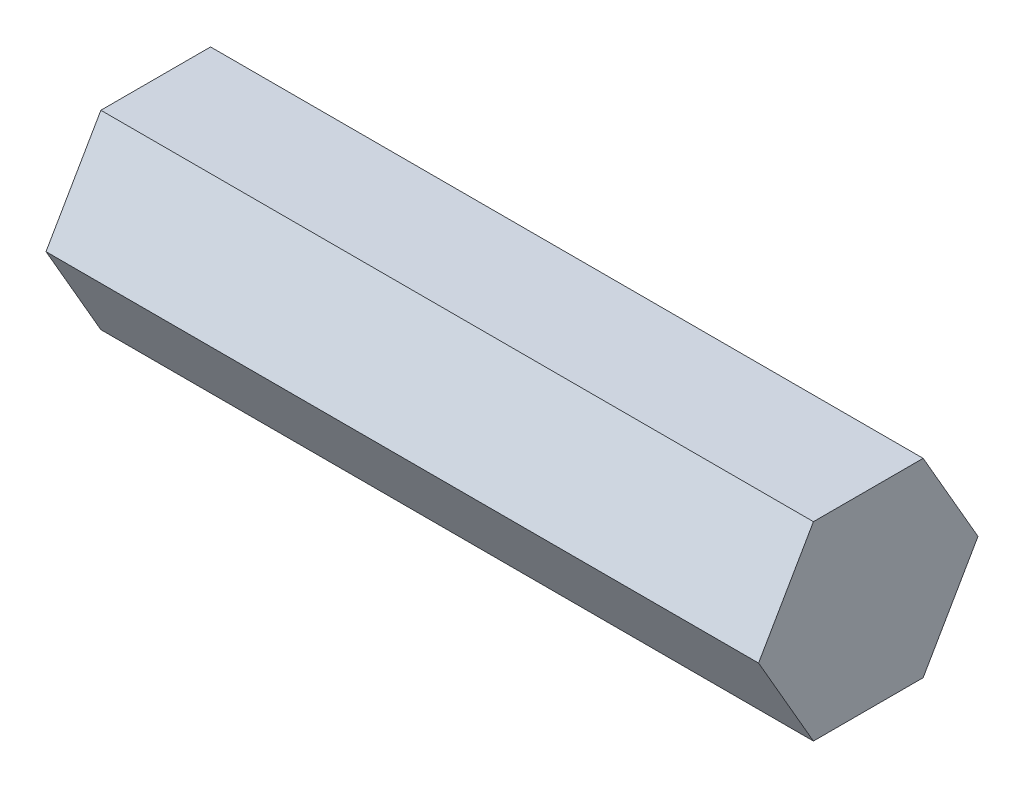
ISO-10303-21;
HEADER;
FILE_DESCRIPTION(('STEP AP214'),'2;1');
FILE_NAME('part.step','',(''),(''),'','','');
FILE_SCHEMA(('AUTOMOTIVE_DESIGN { 1 0 10303 214 1 1 1 1 }'));
ENDSEC;
DATA;
#1=APPLICATION_CONTEXT('core data for automotive mechanical design processes');
#2=APPLICATION_PROTOCOL_DEFINITION('international standard','automotive_design',2000,#1);
#3=PRODUCT_CONTEXT('',#1,'mechanical');
#4=PRODUCT('Part','Part','',(#3));
#5=PRODUCT_RELATED_PRODUCT_CATEGORY('part','',(#4));
#6=PRODUCT_DEFINITION_FORMATION('','',#4);
#7=PRODUCT_DEFINITION_CONTEXT('part definition',#1,'design');
#8=PRODUCT_DEFINITION('design','',#6,#7);
#9=PRODUCT_DEFINITION_SHAPE('','',#8);
#10=(LENGTH_UNIT() NAMED_UNIT(*) SI_UNIT(.MILLI.,.METRE.));
#11=(NAMED_UNIT(*) PLANE_ANGLE_UNIT() SI_UNIT($,.RADIAN.));
#12=(NAMED_UNIT(*) SI_UNIT($,.STERADIAN.) SOLID_ANGLE_UNIT());
#13=UNCERTAINTY_MEASURE_WITH_UNIT(LENGTH_MEASURE(1.E-05),#10,'distance_accuracy_value','');
#14=(GEOMETRIC_REPRESENTATION_CONTEXT(3) GLOBAL_UNCERTAINTY_ASSIGNED_CONTEXT((#13)) GLOBAL_UNIT_ASSIGNED_CONTEXT((#10,
#11,#12)) REPRESENTATION_CONTEXT('',''));
#15=CARTESIAN_POINT('',(0.,0.,0.));
#16=DIRECTION('',(0.,0.,1.));
#17=DIRECTION('',(1.,0.,0.));
#18=AXIS2_PLACEMENT_3D('',#15,#16,#17);
#19=CARTESIAN_POINT('',(0.,0.,0.));
#20=DIRECTION('',(1.,0.,0.));
#21=DIRECTION('',(0.,0.,-1.));
#22=AXIS2_PLACEMENT_3D('',#19,#20,#21);
#23=PLANE('',#22);
#24=DIRECTION('',(0.,-0.866025403784439,0.5));
#25=VECTOR('',#24,1.);
#26=CARTESIAN_POINT('',(0.,2.,1.15470053837925));
#27=LINE('',#26,#25);
#28=CARTESIAN_POINT('',(0.,2.,1.15470053837925));
#29=VERTEX_POINT('',#28);
#30=CARTESIAN_POINT('',(0.,0.,2.3094010767585));
#31=VERTEX_POINT('',#30);
#32=EDGE_CURVE('E100',#29,#31,#27,.T.);
#33=ORIENTED_EDGE('',*,*,#32,.F.);
#34=DIRECTION('',(0.,0.,1.));
#35=VECTOR('',#34,1.);
#36=CARTESIAN_POINT('',(0.,2.,-1.15470053837925));
#37=LINE('',#36,#35);
#38=CARTESIAN_POINT('',(0.,2.,-1.15470053837925));
#39=VERTEX_POINT('',#38);
#40=EDGE_CURVE('E111',#39,#29,#37,.T.);
#41=ORIENTED_EDGE('',*,*,#40,.F.);
#42=DIRECTION('',(0.,0.866025403784438,0.5));
#43=VECTOR('',#42,1.);
#44=CARTESIAN_POINT('',(0.,0.,-2.3094010767585));
#45=LINE('',#44,#43);
#46=CARTESIAN_POINT('',(0.,0.,-2.3094010767585));
#47=VERTEX_POINT('',#46);
#48=EDGE_CURVE('E141',#47,#39,#45,.T.);
#49=ORIENTED_EDGE('',*,*,#48,.F.);
#50=DIRECTION('',(0.,0.866025403784439,-0.5));
#51=VECTOR('',#50,1.);
#52=CARTESIAN_POINT('',(0.,-2.,-1.15470053837925));
#53=LINE('',#52,#51);
#54=CARTESIAN_POINT('',(0.,-2.,-1.15470053837925));
#55=VERTEX_POINT('',#54);
#56=EDGE_CURVE('E88',#55,#47,#53,.T.);
#57=ORIENTED_EDGE('',*,*,#56,.F.);
#58=DIRECTION('',(0.,0.,-1.));
#59=VECTOR('',#58,1.);
#60=CARTESIAN_POINT('',(0.,-2.,1.15470053837925));
#61=LINE('',#60,#59);
#62=CARTESIAN_POINT('',(0.,-2.,1.15470053837925));
#63=VERTEX_POINT('',#62);
#64=EDGE_CURVE('E54',#63,#55,#61,.T.);
#65=ORIENTED_EDGE('',*,*,#64,.F.);
#66=DIRECTION('',(0.,-0.866025403784439,-0.5));
#67=VECTOR('',#66,1.);
#68=CARTESIAN_POINT('',(0.,0.,2.3094010767585));
#69=LINE('',#68,#67);
#70=EDGE_CURVE('E110',#31,#63,#69,.T.);
#71=ORIENTED_EDGE('',*,*,#70,.F.);
#72=EDGE_LOOP('',(#33,#41,#49,#57,#65,#71));
#73=FACE_BOUND('',#72,.T.);
#74=ADVANCED_FACE('F37',(#73),#23,.F.);
#75=CARTESIAN_POINT('',(0.,-2.,-1.15470053837925));
#76=DIRECTION('',(0.,-0.5,-0.866025403784439));
#77=DIRECTION('',(0.,0.866025403784439,-0.5));
#78=AXIS2_PLACEMENT_3D('',#75,#76,#77);
#79=PLANE('',#78);
#80=ORIENTED_EDGE('',*,*,#56,.T.);
#81=DIRECTION('',(1.,0.,0.));
#82=VECTOR('',#81,1.);
#83=CARTESIAN_POINT('',(0.,0.,-2.3094010767585));
#84=LINE('',#83,#82);
#85=CARTESIAN_POINT('',(15.,0.,-2.3094010767585));
#86=VERTEX_POINT('',#85);
#87=EDGE_CURVE('E40',#47,#86,#84,.T.);
#88=ORIENTED_EDGE('',*,*,#87,.T.);
#89=DIRECTION('',(0.,0.866025403784439,-0.5));
#90=VECTOR('',#89,1.);
#91=CARTESIAN_POINT('',(15.,-2.,-1.15470053837925));
#92=LINE('',#91,#90);
#93=CARTESIAN_POINT('',(15.,-2.,-1.15470053837925));
#94=VERTEX_POINT('',#93);
#95=EDGE_CURVE('E120',#94,#86,#92,.T.);
#96=ORIENTED_EDGE('',*,*,#95,.F.);
#97=DIRECTION('',(1.,0.,0.));
#98=VECTOR('',#97,1.);
#99=CARTESIAN_POINT('',(0.,-2.,-1.15470053837925));
#100=LINE('',#99,#98);
#101=EDGE_CURVE('E11',#55,#94,#100,.T.);
#102=ORIENTED_EDGE('',*,*,#101,.F.);
#103=EDGE_LOOP('',(#80,#88,#96,#102));
#104=FACE_BOUND('',#103,.T.);
#105=ADVANCED_FACE('F138',(#104),#79,.T.);
#106=CARTESIAN_POINT('',(0.,-2.,1.15470053837925));
#107=DIRECTION('',(0.,-1.,0.));
#108=DIRECTION('',(0.,0.,-1.));
#109=AXIS2_PLACEMENT_3D('',#106,#107,#108);
#110=PLANE('',#109);
#111=ORIENTED_EDGE('',*,*,#64,.T.);
#112=ORIENTED_EDGE('',*,*,#101,.T.);
#113=DIRECTION('',(0.,0.,-1.));
#114=VECTOR('',#113,1.);
#115=CARTESIAN_POINT('',(15.,-2.,1.15470053837925));
#116=LINE('',#115,#114);
#117=CARTESIAN_POINT('',(15.,-2.,1.15470053837925));
#118=VERTEX_POINT('',#117);
#119=EDGE_CURVE('E81',#118,#94,#116,.T.);
#120=ORIENTED_EDGE('',*,*,#119,.F.);
#121=DIRECTION('',(1.,0.,0.));
#122=VECTOR('',#121,1.);
#123=CARTESIAN_POINT('',(0.,-2.,1.15470053837925));
#124=LINE('',#123,#122);
#125=EDGE_CURVE('E46',#63,#118,#124,.T.);
#126=ORIENTED_EDGE('',*,*,#125,.F.);
#127=EDGE_LOOP('',(#111,#112,#120,#126));
#128=FACE_BOUND('',#127,.T.);
#129=ADVANCED_FACE('F157',(#128),#110,.T.);
#130=CARTESIAN_POINT('',(0.,0.,2.3094010767585));
#131=DIRECTION('',(0.,-0.5,0.866025403784439));
#132=DIRECTION('',(0.,-0.866025403784439,-0.5));
#133=AXIS2_PLACEMENT_3D('',#130,#131,#132);
#134=PLANE('',#133);
#135=ORIENTED_EDGE('',*,*,#70,.T.);
#136=ORIENTED_EDGE('',*,*,#125,.T.);
#137=DIRECTION('',(0.,-0.866025403784439,-0.5));
#138=VECTOR('',#137,1.);
#139=CARTESIAN_POINT('',(15.,0.,2.3094010767585));
#140=LINE('',#139,#138);
#141=CARTESIAN_POINT('',(15.,0.,2.3094010767585));
#142=VERTEX_POINT('',#141);
#143=EDGE_CURVE('E77',#142,#118,#140,.T.);
#144=ORIENTED_EDGE('',*,*,#143,.F.);
#145=DIRECTION('',(1.,0.,0.));
#146=VECTOR('',#145,1.);
#147=CARTESIAN_POINT('',(0.,0.,2.3094010767585));
#148=LINE('',#147,#146);
#149=EDGE_CURVE('E104',#31,#142,#148,.T.);
#150=ORIENTED_EDGE('',*,*,#149,.F.);
#151=EDGE_LOOP('',(#135,#136,#144,#150));
#152=FACE_BOUND('',#151,.T.);
#153=ADVANCED_FACE('F114',(#152),#134,.T.);
#154=CARTESIAN_POINT('',(0.,2.,1.15470053837925));
#155=DIRECTION('',(0.,0.5,0.866025403784439));
#156=DIRECTION('',(0.,-0.866025403784439,0.5));
#157=AXIS2_PLACEMENT_3D('',#154,#155,#156);
#158=PLANE('',#157);
#159=ORIENTED_EDGE('',*,*,#32,.T.);
#160=ORIENTED_EDGE('',*,*,#149,.T.);
#161=DIRECTION('',(0.,-0.866025403784439,0.5));
#162=VECTOR('',#161,1.);
#163=CARTESIAN_POINT('',(15.,2.,1.15470053837925));
#164=LINE('',#163,#162);
#165=CARTESIAN_POINT('',(15.,2.,1.15470053837925));
#166=VERTEX_POINT('',#165);
#167=EDGE_CURVE('E126',#166,#142,#164,.T.);
#168=ORIENTED_EDGE('',*,*,#167,.F.);
#169=DIRECTION('',(1.,0.,0.));
#170=VECTOR('',#169,1.);
#171=CARTESIAN_POINT('',(0.,2.,1.15470053837925));
#172=LINE('',#171,#170);
#173=EDGE_CURVE('E106',#29,#166,#172,.T.);
#174=ORIENTED_EDGE('',*,*,#173,.F.);
#175=EDGE_LOOP('',(#159,#160,#168,#174));
#176=FACE_BOUND('',#175,.T.);
#177=ADVANCED_FACE('F102',(#176),#158,.T.);
#178=CARTESIAN_POINT('',(0.,2.,-1.15470053837925));
#179=DIRECTION('',(0.,1.,0.));
#180=DIRECTION('',(0.,0.,1.));
#181=AXIS2_PLACEMENT_3D('',#178,#179,#180);
#182=PLANE('',#181);
#183=ORIENTED_EDGE('',*,*,#40,.T.);
#184=ORIENTED_EDGE('',*,*,#173,.T.);
#185=DIRECTION('',(0.,0.,1.));
#186=VECTOR('',#185,1.);
#187=CARTESIAN_POINT('',(15.,2.,-1.15470053837925));
#188=LINE('',#187,#186);
#189=CARTESIAN_POINT('',(15.,2.,-1.15470053837925));
#190=VERTEX_POINT('',#189);
#191=EDGE_CURVE('E124',#190,#166,#188,.T.);
#192=ORIENTED_EDGE('',*,*,#191,.F.);
#193=DIRECTION('',(1.,0.,0.));
#194=VECTOR('',#193,1.);
#195=CARTESIAN_POINT('',(0.,2.,-1.15470053837925));
#196=LINE('',#195,#194);
#197=EDGE_CURVE('E131',#39,#190,#196,.T.);
#198=ORIENTED_EDGE('',*,*,#197,.F.);
#199=EDGE_LOOP('',(#183,#184,#192,#198));
#200=FACE_BOUND('',#199,.T.);
#201=ADVANCED_FACE('F145',(#200),#182,.T.);
#202=CARTESIAN_POINT('',(0.,0.,-2.3094010767585));
#203=DIRECTION('',(0.,0.5,-0.866025403784439));
#204=DIRECTION('',(0.,0.866025403784439,0.5));
#205=AXIS2_PLACEMENT_3D('',#202,#203,#204);
#206=PLANE('',#205);
#207=ORIENTED_EDGE('',*,*,#48,.T.);
#208=ORIENTED_EDGE('',*,*,#197,.T.);
#209=DIRECTION('',(0.,0.866025403784438,0.5));
#210=VECTOR('',#209,1.);
#211=CARTESIAN_POINT('',(15.,0.,-2.3094010767585));
#212=LINE('',#211,#210);
#213=EDGE_CURVE('E122',#86,#190,#212,.T.);
#214=ORIENTED_EDGE('',*,*,#213,.F.);
#215=ORIENTED_EDGE('',*,*,#87,.F.);
#216=EDGE_LOOP('',(#207,#208,#214,#215));
#217=FACE_BOUND('',#216,.T.);
#218=ADVANCED_FACE('F140',(#217),#206,.T.);
#219=CARTESIAN_POINT('',(15.,0.,0.));
#220=DIRECTION('',(1.,0.,0.));
#221=DIRECTION('',(0.,0.,-1.));
#222=AXIS2_PLACEMENT_3D('',#219,#220,#221);
#223=PLANE('',#222);
#224=ORIENTED_EDGE('',*,*,#95,.T.);
#225=ORIENTED_EDGE('',*,*,#213,.T.);
#226=ORIENTED_EDGE('',*,*,#191,.T.);
#227=ORIENTED_EDGE('',*,*,#167,.T.);
#228=ORIENTED_EDGE('',*,*,#143,.T.);
#229=ORIENTED_EDGE('',*,*,#119,.T.);
#230=EDGE_LOOP('',(#224,#225,#226,#227,#228,#229));
#231=FACE_BOUND('',#230,.T.);
#232=ADVANCED_FACE('F146',(#231),#223,.T.);
#233=CLOSED_SHELL('',(#74,#105,#129,#153,#177,#201,#218,#232));
#234=MANIFOLD_SOLID_BREP('B2',#233);
#235=ADVANCED_BREP_SHAPE_REPRESENTATION('',(#18,#234),#14);
#236=SHAPE_DEFINITION_REPRESENTATION(#9,#235);
ENDSEC;
END-ISO-10303-21;
